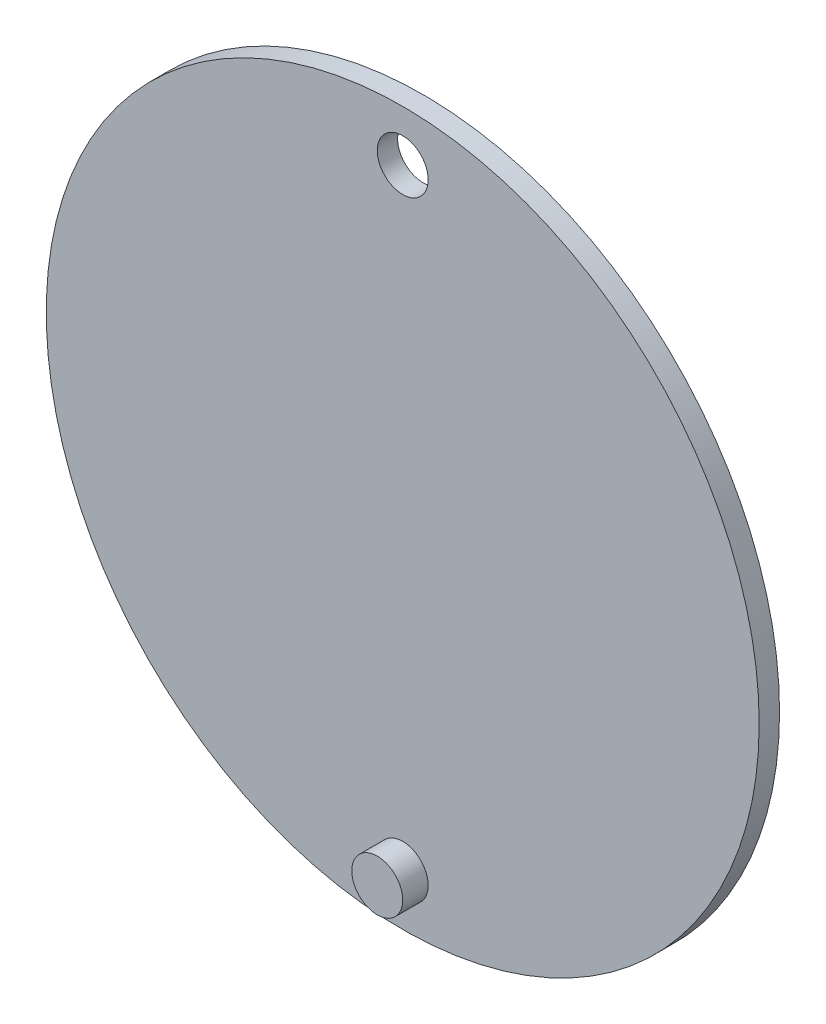
ISO-10303-21;
HEADER;
FILE_DESCRIPTION(('STEP AP214'),'2;1');
FILE_NAME('part.step','',(''),(''),'','','');
FILE_SCHEMA(('AUTOMOTIVE_DESIGN { 1 0 10303 214 1 1 1 1 }'));
ENDSEC;
DATA;
#1=APPLICATION_CONTEXT('core data for automotive mechanical design processes');
#2=APPLICATION_PROTOCOL_DEFINITION('international standard','automotive_design',2000,#1);
#3=PRODUCT_CONTEXT('',#1,'mechanical');
#4=PRODUCT('Part','Part','',(#3));
#5=PRODUCT_RELATED_PRODUCT_CATEGORY('part','',(#4));
#6=PRODUCT_DEFINITION_FORMATION('','',#4);
#7=PRODUCT_DEFINITION_CONTEXT('part definition',#1,'design');
#8=PRODUCT_DEFINITION('design','',#6,#7);
#9=PRODUCT_DEFINITION_SHAPE('','',#8);
#10=(LENGTH_UNIT() NAMED_UNIT(*) SI_UNIT(.MILLI.,.METRE.));
#11=(NAMED_UNIT(*) PLANE_ANGLE_UNIT() SI_UNIT($,.RADIAN.));
#12=(NAMED_UNIT(*) SI_UNIT($,.STERADIAN.) SOLID_ANGLE_UNIT());
#13=UNCERTAINTY_MEASURE_WITH_UNIT(LENGTH_MEASURE(1.E-05),#10,'distance_accuracy_value','');
#14=(GEOMETRIC_REPRESENTATION_CONTEXT(3) GLOBAL_UNCERTAINTY_ASSIGNED_CONTEXT((#13)) GLOBAL_UNIT_ASSIGNED_CONTEXT((#10,
#11,#12)) REPRESENTATION_CONTEXT('',''));
#15=CARTESIAN_POINT('',(0.,0.,0.));
#16=DIRECTION('',(0.,0.,1.));
#17=DIRECTION('',(1.,0.,0.));
#18=AXIS2_PLACEMENT_3D('',#15,#16,#17);
#19=CARTESIAN_POINT('',(0.,0.,5.08));
#20=DIRECTION('',(0.,0.,1.));
#21=DIRECTION('',(1.,0.,0.));
#22=AXIS2_PLACEMENT_3D('',#19,#20,#21);
#23=PLANE('',#22);
#24=CARTESIAN_POINT('',(0.,-76.2,5.08));
#25=DIRECTION('',(0.,0.,1.));
#26=DIRECTION('',(1.,0.,0.));
#27=AXIS2_PLACEMENT_3D('',#24,#25,#26);
#28=CIRCLE('',#27,6.35);
#29=CARTESIAN_POINT('',(6.35,-76.2,5.08));
#30=VERTEX_POINT('',#29);
#31=EDGE_CURVE('E109',#30,#30,#28,.T.);
#32=ORIENTED_EDGE('',*,*,#31,.F.);
#33=EDGE_LOOP('',(#32));
#34=FACE_BOUND('',#33,.T.);
#35=CARTESIAN_POINT('',(0.,0.,5.08));
#36=DIRECTION('',(0.,0.,1.));
#37=DIRECTION('',(1.,0.,0.));
#38=AXIS2_PLACEMENT_3D('',#35,#36,#37);
#39=CIRCLE('',#38,88.9);
#40=CARTESIAN_POINT('',(88.9,0.,5.08));
#41=VERTEX_POINT('',#40);
#42=EDGE_CURVE('E11',#41,#41,#39,.T.);
#43=ORIENTED_EDGE('',*,*,#42,.T.);
#44=EDGE_LOOP('',(#43));
#45=FACE_BOUND('',#44,.T.);
#46=CARTESIAN_POINT('',(0.,76.2,5.08));
#47=DIRECTION('',(0.,0.,1.));
#48=DIRECTION('',(1.,0.,0.));
#49=AXIS2_PLACEMENT_3D('',#46,#47,#48);
#50=CIRCLE('',#49,6.35);
#51=CARTESIAN_POINT('',(6.35,76.2,5.08));
#52=VERTEX_POINT('',#51);
#53=EDGE_CURVE('E105',#52,#52,#50,.T.);
#54=ORIENTED_EDGE('',*,*,#53,.F.);
#55=EDGE_LOOP('',(#54));
#56=FACE_BOUND('',#55,.T.);
#57=ADVANCED_FACE('F43',(#34,#45,#56),#23,.T.);
#58=CARTESIAN_POINT('',(0.,0.,0.));
#59=DIRECTION('',(0.,0.,1.));
#60=DIRECTION('',(1.,0.,0.));
#61=AXIS2_PLACEMENT_3D('',#58,#59,#60);
#62=PLANE('',#61);
#63=CARTESIAN_POINT('',(0.,0.,0.));
#64=DIRECTION('',(0.,0.,1.));
#65=DIRECTION('',(1.,0.,0.));
#66=AXIS2_PLACEMENT_3D('',#63,#64,#65);
#67=CIRCLE('',#66,6.35);
#68=CARTESIAN_POINT('',(6.35,0.,0.));
#69=VERTEX_POINT('',#68);
#70=EDGE_CURVE('E47',#69,#69,#67,.T.);
#71=ORIENTED_EDGE('',*,*,#70,.T.);
#72=EDGE_LOOP('',(#71));
#73=FACE_BOUND('',#72,.T.);
#74=CARTESIAN_POINT('',(0.,0.,0.));
#75=DIRECTION('',(0.,0.,1.));
#76=DIRECTION('',(1.,0.,0.));
#77=AXIS2_PLACEMENT_3D('',#74,#75,#76);
#78=CIRCLE('',#77,88.9);
#79=CARTESIAN_POINT('',(88.9,0.,0.));
#80=VERTEX_POINT('',#79);
#81=EDGE_CURVE('E53',#80,#80,#78,.T.);
#82=ORIENTED_EDGE('',*,*,#81,.F.);
#83=EDGE_LOOP('',(#82));
#84=FACE_BOUND('',#83,.T.);
#85=CARTESIAN_POINT('',(0.,76.2,0.));
#86=DIRECTION('',(0.,0.,1.));
#87=DIRECTION('',(1.,0.,0.));
#88=AXIS2_PLACEMENT_3D('',#85,#86,#87);
#89=CIRCLE('',#88,6.35);
#90=CARTESIAN_POINT('',(6.35,76.2,0.));
#91=VERTEX_POINT('',#90);
#92=EDGE_CURVE('E104',#91,#91,#89,.T.);
#93=ORIENTED_EDGE('',*,*,#92,.T.);
#94=EDGE_LOOP('',(#93));
#95=FACE_BOUND('',#94,.T.);
#96=ADVANCED_FACE('F120',(#73,#84,#95),#62,.F.);
#97=CARTESIAN_POINT('',(0.,0.,5.08));
#98=DIRECTION('',(0.,0.,-1.));
#99=DIRECTION('',(-1.,0.,0.));
#100=AXIS2_PLACEMENT_3D('',#97,#98,#99);
#101=CYLINDRICAL_SURFACE('',#100,88.9);
#102=ORIENTED_EDGE('',*,*,#42,.F.);
#103=EDGE_LOOP('',(#102));
#104=FACE_BOUND('',#103,.T.);
#105=ORIENTED_EDGE('',*,*,#81,.T.);
#106=EDGE_LOOP('',(#105));
#107=FACE_BOUND('',#106,.T.);
#108=ADVANCED_FACE('F45',(#104,#107),#101,.T.);
#109=CARTESIAN_POINT('',(0.,76.2,5.08));
#110=DIRECTION('',(0.,0.,-1.));
#111=DIRECTION('',(-1.,0.,0.));
#112=AXIS2_PLACEMENT_3D('',#109,#110,#111);
#113=CYLINDRICAL_SURFACE('',#112,6.35);
#114=ORIENTED_EDGE('',*,*,#53,.T.);
#115=EDGE_LOOP('',(#114));
#116=FACE_BOUND('',#115,.T.);
#117=ORIENTED_EDGE('',*,*,#92,.F.);
#118=EDGE_LOOP('',(#117));
#119=FACE_BOUND('',#118,.T.);
#120=ADVANCED_FACE('F126',(#116,#119),#113,.F.);
#121=CARTESIAN_POINT('',(0.,-76.2,11.43));
#122=DIRECTION('',(0.,0.,-1.));
#123=DIRECTION('',(-1.,0.,0.));
#124=AXIS2_PLACEMENT_3D('',#121,#122,#123);
#125=CYLINDRICAL_SURFACE('',#124,6.35);
#126=ORIENTED_EDGE('',*,*,#31,.T.);
#127=EDGE_LOOP('',(#126));
#128=FACE_BOUND('',#127,.T.);
#129=CARTESIAN_POINT('',(0.,-76.2,11.43));
#130=DIRECTION('',(0.,0.,1.));
#131=DIRECTION('',(1.,0.,0.));
#132=AXIS2_PLACEMENT_3D('',#129,#130,#131);
#133=CIRCLE('',#132,6.35);
#134=CARTESIAN_POINT('',(6.35,-76.2,11.43));
#135=VERTEX_POINT('',#134);
#136=EDGE_CURVE('E100',#135,#135,#133,.T.);
#137=ORIENTED_EDGE('',*,*,#136,.F.);
#138=EDGE_LOOP('',(#137));
#139=FACE_BOUND('',#138,.T.);
#140=ADVANCED_FACE('F128',(#128,#139),#125,.T.);
#141=CARTESIAN_POINT('',(0.,-76.2,11.43));
#142=DIRECTION('',(0.,0.,1.));
#143=DIRECTION('',(1.,0.,0.));
#144=AXIS2_PLACEMENT_3D('',#141,#142,#143);
#145=PLANE('',#144);
#146=ORIENTED_EDGE('',*,*,#136,.T.);
#147=EDGE_LOOP('',(#146));
#148=FACE_BOUND('',#147,.T.);
#149=ADVANCED_FACE('F135',(#148),#145,.T.);
#150=CARTESIAN_POINT('',(0.,0.,-45.72));
#151=DIRECTION('',(0.,0.,1.));
#152=DIRECTION('',(1.,0.,0.));
#153=AXIS2_PLACEMENT_3D('',#150,#151,#152);
#154=CYLINDRICAL_SURFACE('',#153,6.35);
#155=CARTESIAN_POINT('',(0.,0.,-45.72));
#156=DIRECTION('',(0.,0.,1.));
#157=DIRECTION('',(1.,0.,0.));
#158=AXIS2_PLACEMENT_3D('',#155,#156,#157);
#159=CIRCLE('',#158,6.35);
#160=CARTESIAN_POINT('',(6.35,0.,-45.72));
#161=VERTEX_POINT('',#160);
#162=EDGE_CURVE('E78',#161,#161,#159,.T.);
#163=ORIENTED_EDGE('',*,*,#162,.T.);
#164=EDGE_LOOP('',(#163));
#165=FACE_BOUND('',#164,.T.);
#166=ORIENTED_EDGE('',*,*,#70,.F.);
#167=EDGE_LOOP('',(#166));
#168=FACE_BOUND('',#167,.T.);
#169=ADVANCED_FACE('F153',(#165,#168),#154,.T.);
#170=CARTESIAN_POINT('',(0.,0.,-45.72));
#171=DIRECTION('',(0.,0.,1.));
#172=DIRECTION('',(1.,0.,0.));
#173=AXIS2_PLACEMENT_3D('',#170,#171,#172);
#174=PLANE('',#173);
#175=DIRECTION('',(0.,1.,0.));
#176=VECTOR('',#175,1.);
#177=CARTESIAN_POINT('',(-3.05,2.66458251889485,-45.72));
#178=LINE('',#177,#176);
#179=CARTESIAN_POINT('',(-3.05,-2.66458251889485,-45.72));
#180=VERTEX_POINT('',#179);
#181=CARTESIAN_POINT('',(-3.05,2.66458251889485,-45.72));
#182=VERTEX_POINT('',#181);
#183=EDGE_CURVE('E82',#180,#182,#178,.T.);
#184=ORIENTED_EDGE('',*,*,#183,.F.);
#185=CARTESIAN_POINT('',(0.,0.,-45.72));
#186=DIRECTION('',(0.,0.,-1.));
#187=DIRECTION('',(-1.,0.,0.));
#188=AXIS2_PLACEMENT_3D('',#185,#186,#187);
#189=CIRCLE('',#188,4.05);
#190=EDGE_CURVE('E61',#182,#180,#189,.T.);
#191=ORIENTED_EDGE('',*,*,#190,.F.);
#192=EDGE_LOOP('',(#184,#191));
#193=FACE_BOUND('',#192,.T.);
#194=ORIENTED_EDGE('',*,*,#162,.F.);
#195=EDGE_LOOP('',(#194));
#196=FACE_BOUND('',#195,.T.);
#197=ADVANCED_FACE('F87',(#193,#196),#174,.F.);
#198=CARTESIAN_POINT('',(0.,0.,-27.72));
#199=DIRECTION('',(0.,0.,-1.));
#200=DIRECTION('',(-1.,0.,0.));
#201=AXIS2_PLACEMENT_3D('',#198,#199,#200);
#202=CYLINDRICAL_SURFACE('',#201,4.05);
#203=ORIENTED_EDGE('',*,*,#190,.T.);
#204=DIRECTION('',(0.,0.,-1.));
#205=VECTOR('',#204,1.);
#206=CARTESIAN_POINT('',(-3.05,-2.66458251889485,-27.72));
#207=LINE('',#206,#205);
#208=CARTESIAN_POINT('',(-3.05,-2.66458251889485,-27.72));
#209=VERTEX_POINT('',#208);
#210=EDGE_CURVE('E79',#209,#180,#207,.T.);
#211=ORIENTED_EDGE('',*,*,#210,.F.);
#212=CARTESIAN_POINT('',(0.,0.,-27.72));
#213=DIRECTION('',(0.,0.,-1.));
#214=DIRECTION('',(-1.,0.,0.));
#215=AXIS2_PLACEMENT_3D('',#212,#213,#214);
#216=CIRCLE('',#215,4.05);
#217=CARTESIAN_POINT('',(-3.05,2.66458251889485,-27.72));
#218=VERTEX_POINT('',#217);
#219=EDGE_CURVE('E75',#218,#209,#216,.T.);
#220=ORIENTED_EDGE('',*,*,#219,.F.);
#221=DIRECTION('',(0.,0.,-1.));
#222=VECTOR('',#221,1.);
#223=CARTESIAN_POINT('',(-3.05,2.66458251889485,-27.72));
#224=LINE('',#223,#222);
#225=EDGE_CURVE('E69',#218,#182,#224,.T.);
#226=ORIENTED_EDGE('',*,*,#225,.T.);
#227=EDGE_LOOP('',(#203,#211,#220,#226));
#228=FACE_BOUND('',#227,.T.);
#229=ADVANCED_FACE('F73',(#228),#202,.F.);
#230=CARTESIAN_POINT('',(-3.05,2.66458251889485,-27.72));
#231=DIRECTION('',(-1.,0.,0.));
#232=DIRECTION('',(0.,0.,1.));
#233=AXIS2_PLACEMENT_3D('',#230,#231,#232);
#234=PLANE('',#233);
#235=ORIENTED_EDGE('',*,*,#183,.T.);
#236=ORIENTED_EDGE('',*,*,#225,.F.);
#237=DIRECTION('',(0.,1.,0.));
#238=VECTOR('',#237,1.);
#239=CARTESIAN_POINT('',(-3.05,2.66458251889485,-27.72));
#240=LINE('',#239,#238);
#241=EDGE_CURVE('E92',#209,#218,#240,.T.);
#242=ORIENTED_EDGE('',*,*,#241,.F.);
#243=ORIENTED_EDGE('',*,*,#210,.T.);
#244=EDGE_LOOP('',(#235,#236,#242,#243));
#245=FACE_BOUND('',#244,.T.);
#246=ADVANCED_FACE('F83',(#245),#234,.F.);
#247=CARTESIAN_POINT('',(0.,0.,-27.72));
#248=DIRECTION('',(0.,0.,-1.));
#249=DIRECTION('',(-1.,0.,0.));
#250=AXIS2_PLACEMENT_3D('',#247,#248,#249);
#251=PLANE('',#250);
#252=ORIENTED_EDGE('',*,*,#219,.T.);
#253=ORIENTED_EDGE('',*,*,#241,.T.);
#254=EDGE_LOOP('',(#252,#253));
#255=FACE_BOUND('',#254,.T.);
#256=ADVANCED_FACE('F167',(#255),#251,.T.);
#257=CLOSED_SHELL('',(#57,#96,#108,#120,#140,#149,#169,#197,#229,#246,#256));
#258=MANIFOLD_SOLID_BREP('B2',#257);
#259=ADVANCED_BREP_SHAPE_REPRESENTATION('',(#18,#258),#14);
#260=SHAPE_DEFINITION_REPRESENTATION(#9,#259);
ENDSEC;
END-ISO-10303-21;
